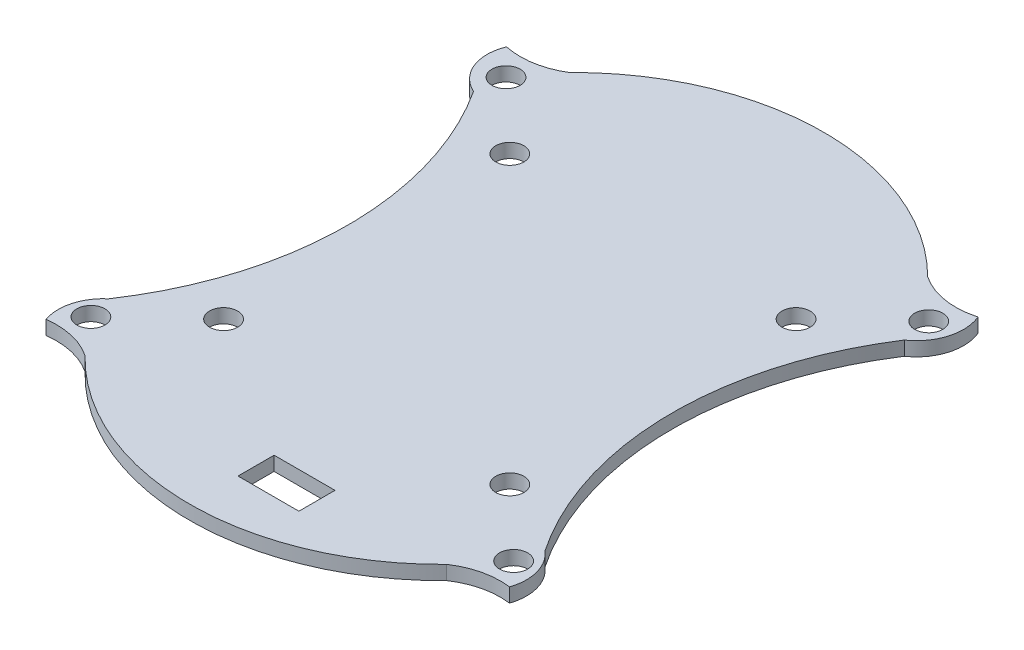
ISO-10303-21;
HEADER;
FILE_DESCRIPTION(('STEP AP214'),'2;1');
FILE_NAME('part.step','',(''),(''),'','','');
FILE_SCHEMA(('AUTOMOTIVE_DESIGN { 1 0 10303 214 1 1 1 1 }'));
ENDSEC;
DATA;
#1=APPLICATION_CONTEXT('core data for automotive mechanical design processes');
#2=APPLICATION_PROTOCOL_DEFINITION('international standard','automotive_design',2000,#1);
#3=PRODUCT_CONTEXT('',#1,'mechanical');
#4=PRODUCT('Part','Part','',(#3));
#5=PRODUCT_RELATED_PRODUCT_CATEGORY('part','',(#4));
#6=PRODUCT_DEFINITION_FORMATION('','',#4);
#7=PRODUCT_DEFINITION_CONTEXT('part definition',#1,'design');
#8=PRODUCT_DEFINITION('design','',#6,#7);
#9=PRODUCT_DEFINITION_SHAPE('','',#8);
#10=(LENGTH_UNIT() NAMED_UNIT(*) SI_UNIT(.MILLI.,.METRE.));
#11=(NAMED_UNIT(*) PLANE_ANGLE_UNIT() SI_UNIT($,.RADIAN.));
#12=(NAMED_UNIT(*) SI_UNIT($,.STERADIAN.) SOLID_ANGLE_UNIT());
#13=UNCERTAINTY_MEASURE_WITH_UNIT(LENGTH_MEASURE(1.E-05),#10,'distance_accuracy_value','');
#14=(GEOMETRIC_REPRESENTATION_CONTEXT(3) GLOBAL_UNCERTAINTY_ASSIGNED_CONTEXT((#13)) GLOBAL_UNIT_ASSIGNED_CONTEXT((#10,
#11,#12)) REPRESENTATION_CONTEXT('',''));
#15=CARTESIAN_POINT('',(0.,0.,0.));
#16=DIRECTION('',(0.,0.,1.));
#17=DIRECTION('',(1.,0.,0.));
#18=AXIS2_PLACEMENT_3D('',#15,#16,#17);
#19=CARTESIAN_POINT('',(0.,1.5,25.1156371011229));
#20=DIRECTION('',(0.,0.,-1.));
#21=DIRECTION('',(-1.,0.,0.));
#22=AXIS2_PLACEMENT_3D('',#19,#20,#21);
#23=PLANE('',#22);
#24=DIRECTION('',(1.,0.,0.));
#25=VECTOR('',#24,1.);
#26=CARTESIAN_POINT('',(0.,0.,25.1156371011229));
#27=LINE('',#26,#25);
#28=CARTESIAN_POINT('',(0.,0.,25.1156371011229));
#29=VERTEX_POINT('',#28);
#30=CARTESIAN_POINT('',(6.48858439949151,0.,25.1156371011229));
#31=VERTEX_POINT('',#30);
#32=EDGE_CURVE('E241',#29,#31,#27,.T.);
#33=ORIENTED_EDGE('',*,*,#32,.T.);
#34=DIRECTION('',(0.,-1.,0.));
#35=VECTOR('',#34,1.);
#36=CARTESIAN_POINT('',(6.48858439949151,1.5,25.1156371011229));
#37=LINE('',#36,#35);
#38=CARTESIAN_POINT('',(6.48858439949151,1.5,25.1156371011229));
#39=VERTEX_POINT('',#38);
#40=EDGE_CURVE('E11',#39,#31,#37,.T.);
#41=ORIENTED_EDGE('',*,*,#40,.F.);
#42=DIRECTION('',(1.,0.,0.));
#43=VECTOR('',#42,1.);
#44=CARTESIAN_POINT('',(0.,1.5,25.1156371011229));
#45=LINE('',#44,#43);
#46=CARTESIAN_POINT('',(0.,1.5,25.1156371011229));
#47=VERTEX_POINT('',#46);
#48=EDGE_CURVE('E164',#47,#39,#45,.T.);
#49=ORIENTED_EDGE('',*,*,#48,.F.);
#50=DIRECTION('',(0.,-1.,0.));
#51=VECTOR('',#50,1.);
#52=CARTESIAN_POINT('',(0.,1.5,25.1156371011229));
#53=LINE('',#52,#51);
#54=EDGE_CURVE('E55',#47,#29,#53,.T.);
#55=ORIENTED_EDGE('',*,*,#54,.T.);
#56=EDGE_LOOP('',(#33,#41,#49,#55));
#57=FACE_BOUND('',#56,.T.);
#58=ADVANCED_FACE('F36',(#57),#23,.F.);
#59=CARTESIAN_POINT('',(6.48858439949151,1.5,0.));
#60=DIRECTION('',(1.,0.,0.));
#61=DIRECTION('',(0.,0.,-1.));
#62=AXIS2_PLACEMENT_3D('',#59,#60,#61);
#63=PLANE('',#62);
#64=DIRECTION('',(0.,0.,1.));
#65=VECTOR('',#64,1.);
#66=CARTESIAN_POINT('',(6.48858439949151,0.,0.));
#67=LINE('',#66,#65);
#68=CARTESIAN_POINT('',(6.48858439949151,0.,28.9622381461072));
#69=VERTEX_POINT('',#68);
#70=EDGE_CURVE('E170',#31,#69,#67,.T.);
#71=ORIENTED_EDGE('',*,*,#70,.T.);
#72=DIRECTION('',(0.,-1.,0.));
#73=VECTOR('',#72,1.);
#74=CARTESIAN_POINT('',(6.48858439949151,1.5,28.9622381461072));
#75=LINE('',#74,#73);
#76=CARTESIAN_POINT('',(6.48858439949151,1.5,28.9622381461072));
#77=VERTEX_POINT('',#76);
#78=EDGE_CURVE('E46',#77,#69,#75,.T.);
#79=ORIENTED_EDGE('',*,*,#78,.F.);
#80=DIRECTION('',(0.,0.,1.));
#81=VECTOR('',#80,1.);
#82=CARTESIAN_POINT('',(6.48858439949151,1.5,0.));
#83=LINE('',#82,#81);
#84=EDGE_CURVE('E157',#39,#77,#83,.T.);
#85=ORIENTED_EDGE('',*,*,#84,.F.);
#86=ORIENTED_EDGE('',*,*,#40,.T.);
#87=EDGE_LOOP('',(#71,#79,#85,#86));
#88=FACE_BOUND('',#87,.T.);
#89=ADVANCED_FACE('F169',(#88),#63,.F.);
#90=CARTESIAN_POINT('',(0.,1.5,28.9622381461072));
#91=DIRECTION('',(0.,0.,-1.));
#92=DIRECTION('',(-1.,0.,0.));
#93=AXIS2_PLACEMENT_3D('',#90,#91,#92);
#94=PLANE('',#93);
#95=DIRECTION('',(1.,0.,0.));
#96=VECTOR('',#95,1.);
#97=CARTESIAN_POINT('',(0.,0.,28.9622381461072));
#98=LINE('',#97,#96);
#99=CARTESIAN_POINT('',(0.,0.,28.9622381461072));
#100=VERTEX_POINT('',#99);
#101=EDGE_CURVE('E244',#100,#69,#98,.T.);
#102=ORIENTED_EDGE('',*,*,#101,.F.);
#103=DIRECTION('',(0.,-1.,0.));
#104=VECTOR('',#103,1.);
#105=CARTESIAN_POINT('',(0.,1.5,28.9622381461072));
#106=LINE('',#105,#104);
#107=CARTESIAN_POINT('',(0.,1.5,28.9622381461072));
#108=VERTEX_POINT('',#107);
#109=EDGE_CURVE('E105',#108,#100,#106,.T.);
#110=ORIENTED_EDGE('',*,*,#109,.F.);
#111=DIRECTION('',(1.,0.,0.));
#112=VECTOR('',#111,1.);
#113=CARTESIAN_POINT('',(0.,1.5,28.9622381461072));
#114=LINE('',#113,#112);
#115=EDGE_CURVE('E163',#108,#77,#114,.T.);
#116=ORIENTED_EDGE('',*,*,#115,.T.);
#117=ORIENTED_EDGE('',*,*,#78,.T.);
#118=EDGE_LOOP('',(#102,#110,#116,#117));
#119=FACE_BOUND('',#118,.T.);
#120=ADVANCED_FACE('F174',(#119),#94,.T.);
#121=CARTESIAN_POINT('',(52.2988389245006,1.5,-0.0202742070100833));
#122=DIRECTION('',(0.,-1.,0.));
#123=DIRECTION('',(0.,0.,-1.));
#124=AXIS2_PLACEMENT_3D('',#121,#122,#123);
#125=CYLINDRICAL_SURFACE('',#124,35.);
#126=CARTESIAN_POINT('',(52.2988389245006,0.,-0.0202742070100833));
#127=DIRECTION('',(0.,1.,0.));
#128=DIRECTION('',(0.,0.,1.));
#129=AXIS2_PLACEMENT_3D('',#126,#127,#128);
#130=CIRCLE('',#129,35.);
#131=CARTESIAN_POINT('',(22.9453690464108,0.,-19.0826404325361));
#132=VERTEX_POINT('',#131);
#133=CARTESIAN_POINT('',(23.2479965445702,0.,19.5001908749607));
#134=VERTEX_POINT('',#133);
#135=EDGE_CURVE('E202',#132,#134,#130,.T.);
#136=ORIENTED_EDGE('',*,*,#135,.F.);
#137=DIRECTION('',(0.,-1.,0.));
#138=VECTOR('',#137,1.);
#139=CARTESIAN_POINT('',(22.9453690464108,1.5,-19.0826404325361));
#140=LINE('',#139,#138);
#141=CARTESIAN_POINT('',(22.9453690464108,1.5,-19.0826404325361));
#142=VERTEX_POINT('',#141);
#143=EDGE_CURVE('E40',#142,#132,#140,.T.);
#144=ORIENTED_EDGE('',*,*,#143,.F.);
#145=CARTESIAN_POINT('',(52.2988389245006,1.5,-0.0202742070100833));
#146=DIRECTION('',(0.,1.,0.));
#147=DIRECTION('',(0.,0.,1.));
#148=AXIS2_PLACEMENT_3D('',#145,#146,#147);
#149=CIRCLE('',#148,35.);
#150=CARTESIAN_POINT('',(23.2479965445702,1.5,19.5001908749607));
#151=VERTEX_POINT('',#150);
#152=EDGE_CURVE('E294',#142,#151,#149,.T.);
#153=ORIENTED_EDGE('',*,*,#152,.T.);
#154=DIRECTION('',(0.,-1.,0.));
#155=VECTOR('',#154,1.);
#156=CARTESIAN_POINT('',(23.2479965445702,1.5,19.5001908749607));
#157=LINE('',#156,#155);
#158=EDGE_CURVE('E186',#151,#134,#157,.T.);
#159=ORIENTED_EDGE('',*,*,#158,.T.);
#160=EDGE_LOOP('',(#136,#144,#153,#159));
#161=FACE_BOUND('',#160,.T.);
#162=ADVANCED_FACE('F293',(#161),#125,.F.);
#163=CARTESIAN_POINT('',(20.1331524965118,1.5,-23.2168196831823));
#164=DIRECTION('',(0.,-1.,0.));
#165=DIRECTION('',(0.,0.,-1.));
#166=AXIS2_PLACEMENT_3D('',#163,#164,#165);
#167=CYLINDRICAL_SURFACE('',#166,4.99999999999994);
#168=CARTESIAN_POINT('',(20.1331524965118,0.,-23.2168196831823));
#169=DIRECTION('',(0.,1.,0.));
#170=DIRECTION('',(0.,0.,1.));
#171=AXIS2_PLACEMENT_3D('',#168,#169,#170);
#172=CIRCLE('',#171,4.99999999999994);
#173=CARTESIAN_POINT('',(24.7501956341751,0.,-25.135911308133));
#174=VERTEX_POINT('',#173);
#175=EDGE_CURVE('E205',#132,#174,#172,.T.);
#176=ORIENTED_EDGE('',*,*,#175,.T.);
#177=DIRECTION('',(0.,-1.,0.));
#178=VECTOR('',#177,1.);
#179=CARTESIAN_POINT('',(24.7501956341751,1.5,-25.135911308133));
#180=LINE('',#179,#178);
#181=CARTESIAN_POINT('',(24.7501956341751,1.5,-25.135911308133));
#182=VERTEX_POINT('',#181);
#183=EDGE_CURVE('E279',#182,#174,#180,.T.);
#184=ORIENTED_EDGE('',*,*,#183,.F.);
#185=CARTESIAN_POINT('',(20.1331524965118,1.5,-23.2168196831823));
#186=DIRECTION('',(0.,1.,0.));
#187=DIRECTION('',(0.,0.,1.));
#188=AXIS2_PLACEMENT_3D('',#185,#186,#187);
#189=CIRCLE('',#188,4.99999999999994);
#190=EDGE_CURVE('E287',#142,#182,#189,.T.);
#191=ORIENTED_EDGE('',*,*,#190,.F.);
#192=ORIENTED_EDGE('',*,*,#143,.T.);
#193=EDGE_LOOP('',(#176,#184,#191,#192));
#194=FACE_BOUND('',#193,.T.);
#195=ADVANCED_FACE('F285',(#194),#167,.T.);
#196=CARTESIAN_POINT('',(22.6669223283037,1.5,-32.5632367808343));
#197=DIRECTION('',(0.,-1.,0.));
#198=DIRECTION('',(0.,0.,-1.));
#199=AXIS2_PLACEMENT_3D('',#196,#197,#198);
#200=CYLINDRICAL_SURFACE('',#199,7.71396080780776);
#201=CARTESIAN_POINT('',(22.6669223283037,0.,-32.5632367808343));
#202=DIRECTION('',(0.,1.,0.));
#203=DIRECTION('',(0.,0.,1.));
#204=AXIS2_PLACEMENT_3D('',#201,#202,#203);
#205=CIRCLE('',#204,7.71396080780776);
#206=CARTESIAN_POINT('',(18.3598915410994,0.,-26.16365264259));
#207=VERTEX_POINT('',#206);
#208=EDGE_CURVE('E208',#174,#207,#205,.F.);
#209=ORIENTED_EDGE('',*,*,#208,.T.);
#210=DIRECTION('',(0.,-1.,0.));
#211=VECTOR('',#210,1.);
#212=CARTESIAN_POINT('',(18.3598915410994,1.5,-26.16365264259));
#213=LINE('',#212,#211);
#214=CARTESIAN_POINT('',(18.3598915410994,1.5,-26.16365264259));
#215=VERTEX_POINT('',#214);
#216=EDGE_CURVE('E278',#215,#207,#213,.T.);
#217=ORIENTED_EDGE('',*,*,#216,.F.);
#218=CARTESIAN_POINT('',(22.6669223283037,1.5,-32.5632367808343));
#219=DIRECTION('',(0.,1.,0.));
#220=DIRECTION('',(0.,0.,1.));
#221=AXIS2_PLACEMENT_3D('',#218,#219,#220);
#222=CIRCLE('',#221,7.71396080780776);
#223=EDGE_CURVE('E631',#182,#215,#222,.F.);
#224=ORIENTED_EDGE('',*,*,#223,.F.);
#225=ORIENTED_EDGE('',*,*,#183,.T.);
#226=EDGE_LOOP('',(#209,#217,#224,#225));
#227=FACE_BOUND('',#226,.T.);
#228=ADVANCED_FACE('F345',(#227),#200,.F.);
#229=CARTESIAN_POINT('',(-0.494481329102561,1.5,-7.30927977238811));
#230=DIRECTION('',(0.,-1.,0.));
#231=DIRECTION('',(0.,0.,-1.));
#232=AXIS2_PLACEMENT_3D('',#229,#230,#231);
#233=CYLINDRICAL_SURFACE('',#232,26.6641098230789);
#234=CARTESIAN_POINT('',(-0.494481329102561,0.,-7.30927977238811));
#235=DIRECTION('',(0.,1.,0.));
#236=DIRECTION('',(0.,0.,1.));
#237=AXIS2_PLACEMENT_3D('',#234,#235,#236);
#238=CIRCLE('',#237,26.6641098230789);
#239=CARTESIAN_POINT('',(-19.5823192862826,0.,-25.9272601885785));
#240=VERTEX_POINT('',#239);
#241=EDGE_CURVE('E211',#240,#207,#238,.F.);
#242=ORIENTED_EDGE('',*,*,#241,.F.);
#243=DIRECTION('',(0.,-1.,0.));
#244=VECTOR('',#243,1.);
#245=CARTESIAN_POINT('',(-19.5823192862826,1.5,-25.9272601885785));
#246=LINE('',#245,#244);
#247=CARTESIAN_POINT('',(-19.5823192862826,1.5,-25.9272601885785));
#248=VERTEX_POINT('',#247);
#249=EDGE_CURVE('E276',#248,#240,#246,.T.);
#250=ORIENTED_EDGE('',*,*,#249,.F.);
#251=CARTESIAN_POINT('',(-0.494481329102561,1.5,-7.30927977238811));
#252=DIRECTION('',(0.,1.,0.));
#253=DIRECTION('',(0.,0.,1.));
#254=AXIS2_PLACEMENT_3D('',#251,#252,#253);
#255=CIRCLE('',#254,26.6641098230789);
#256=EDGE_CURVE('E344',#248,#215,#255,.F.);
#257=ORIENTED_EDGE('',*,*,#256,.T.);
#258=ORIENTED_EDGE('',*,*,#216,.T.);
#259=EDGE_LOOP('',(#242,#250,#257,#258));
#260=FACE_BOUND('',#259,.T.);
#261=ADVANCED_FACE('F342',(#260),#233,.T.);
#262=CARTESIAN_POINT('',(-23.6558849865088,1.5,-32.5632367808344));
#263=DIRECTION('',(0.,-1.,0.));
#264=DIRECTION('',(0.,0.,-1.));
#265=AXIS2_PLACEMENT_3D('',#262,#263,#264);
#266=CYLINDRICAL_SURFACE('',#265,7.78653471365966);
#267=CARTESIAN_POINT('',(-23.6558849865088,0.,-32.5632367808344));
#268=DIRECTION('',(0.,1.,0.));
#269=DIRECTION('',(0.,0.,1.));
#270=AXIS2_PLACEMENT_3D('',#267,#268,#269);
#271=CIRCLE('',#270,7.78653471365966);
#272=CARTESIAN_POINT('',(-25.2944195878264,0.,-24.951053965944));
#273=VERTEX_POINT('',#272);
#274=EDGE_CURVE('E214',#273,#240,#271,.T.);
#275=ORIENTED_EDGE('',*,*,#274,.F.);
#276=DIRECTION('',(0.,-1.,0.));
#277=VECTOR('',#276,1.);
#278=CARTESIAN_POINT('',(-25.2944195878264,1.5,-24.951053965944));
#279=LINE('',#278,#277);
#280=CARTESIAN_POINT('',(-25.2944195878264,1.5,-24.951053965944));
#281=VERTEX_POINT('',#280);
#282=EDGE_CURVE('E274',#281,#273,#279,.T.);
#283=ORIENTED_EDGE('',*,*,#282,.F.);
#284=CARTESIAN_POINT('',(-23.6558849865088,1.5,-32.5632367808344));
#285=DIRECTION('',(0.,1.,0.));
#286=DIRECTION('',(0.,0.,1.));
#287=AXIS2_PLACEMENT_3D('',#284,#285,#286);
#288=CIRCLE('',#287,7.78653471365966);
#289=EDGE_CURVE('E338',#281,#248,#288,.T.);
#290=ORIENTED_EDGE('',*,*,#289,.T.);
#291=ORIENTED_EDGE('',*,*,#249,.T.);
#292=EDGE_LOOP('',(#275,#283,#290,#291));
#293=FACE_BOUND('',#292,.T.);
#294=ADVANCED_FACE('F335',(#293),#266,.F.);
#295=CARTESIAN_POINT('',(-21.1221151547169,1.5,-23.2168196831823));
#296=DIRECTION('',(0.,-1.,0.));
#297=DIRECTION('',(0.,0.,-1.));
#298=AXIS2_PLACEMENT_3D('',#295,#296,#297);
#299=CYLINDRICAL_SURFACE('',#298,4.5183728077761);
#300=CARTESIAN_POINT('',(-21.1221151547169,0.,-23.2168196831823));
#301=DIRECTION('',(0.,1.,0.));
#302=DIRECTION('',(0.,0.,1.));
#303=AXIS2_PLACEMENT_3D('',#300,#301,#302);
#304=CIRCLE('',#303,4.5183728077761);
#305=CARTESIAN_POINT('',(-22.9453690464108,0.,-19.0826404325361));
#306=VERTEX_POINT('',#305);
#307=EDGE_CURVE('E217',#306,#273,#304,.F.);
#308=ORIENTED_EDGE('',*,*,#307,.F.);
#309=DIRECTION('',(0.,-1.,0.));
#310=VECTOR('',#309,1.);
#311=CARTESIAN_POINT('',(-22.9453690464108,1.5,-19.0826404325361));
#312=LINE('',#311,#310);
#313=CARTESIAN_POINT('',(-22.9453690464108,1.5,-19.0826404325361));
#314=VERTEX_POINT('',#313);
#315=EDGE_CURVE('E272',#314,#306,#312,.T.);
#316=ORIENTED_EDGE('',*,*,#315,.F.);
#317=CARTESIAN_POINT('',(-21.1221151547169,1.5,-23.2168196831823));
#318=DIRECTION('',(0.,1.,0.));
#319=DIRECTION('',(0.,0.,1.));
#320=AXIS2_PLACEMENT_3D('',#317,#318,#319);
#321=CIRCLE('',#320,4.5183728077761);
#322=EDGE_CURVE('E331',#314,#281,#321,.F.);
#323=ORIENTED_EDGE('',*,*,#322,.T.);
#324=ORIENTED_EDGE('',*,*,#282,.T.);
#325=EDGE_LOOP('',(#308,#316,#323,#324));
#326=FACE_BOUND('',#325,.T.);
#327=ADVANCED_FACE('F330',(#326),#299,.T.);
#328=CARTESIAN_POINT('',(-52.2988389245006,1.5,-0.0202742070100833));
#329=DIRECTION('',(0.,-1.,0.));
#330=DIRECTION('',(0.,0.,-1.));
#331=AXIS2_PLACEMENT_3D('',#328,#329,#330);
#332=CYLINDRICAL_SURFACE('',#331,35.);
#333=CARTESIAN_POINT('',(-52.2988389245006,0.,-0.0202742070100833));
#334=DIRECTION('',(0.,1.,0.));
#335=DIRECTION('',(0.,0.,1.));
#336=AXIS2_PLACEMENT_3D('',#333,#334,#335);
#337=CIRCLE('',#336,35.);
#338=CARTESIAN_POINT('',(-23.2479965445702,0.,19.5001908749607));
#339=VERTEX_POINT('',#338);
#340=EDGE_CURVE('E220',#306,#339,#337,.F.);
#341=ORIENTED_EDGE('',*,*,#340,.T.);
#342=DIRECTION('',(0.,-1.,0.));
#343=VECTOR('',#342,1.);
#344=CARTESIAN_POINT('',(-23.2479965445702,1.5,19.5001908749607));
#345=LINE('',#344,#343);
#346=CARTESIAN_POINT('',(-23.2479965445702,1.5,19.5001908749607));
#347=VERTEX_POINT('',#346);
#348=EDGE_CURVE('E269',#347,#339,#345,.T.);
#349=ORIENTED_EDGE('',*,*,#348,.F.);
#350=CARTESIAN_POINT('',(-52.2988389245006,1.5,-0.0202742070100833));
#351=DIRECTION('',(0.,1.,0.));
#352=DIRECTION('',(0.,0.,1.));
#353=AXIS2_PLACEMENT_3D('',#350,#351,#352);
#354=CIRCLE('',#353,35.);
#355=EDGE_CURVE('E326',#314,#347,#354,.F.);
#356=ORIENTED_EDGE('',*,*,#355,.F.);
#357=ORIENTED_EDGE('',*,*,#315,.T.);
#358=EDGE_LOOP('',(#341,#349,#356,#357));
#359=FACE_BOUND('',#358,.T.);
#360=ADVANCED_FACE('F325',(#359),#332,.F.);
#361=CARTESIAN_POINT('',(-20.1331524965118,1.5,23.1762712691621));
#362=DIRECTION('',(0.,-1.,0.));
#363=DIRECTION('',(0.,0.,-1.));
#364=AXIS2_PLACEMENT_3D('',#361,#362,#363);
#365=CYLINDRICAL_SURFACE('',#364,4.81827982877257);
#366=CARTESIAN_POINT('',(-20.1331524965118,0.,23.1762712691621));
#367=DIRECTION('',(0.,1.,0.));
#368=DIRECTION('',(0.,0.,1.));
#369=AXIS2_PLACEMENT_3D('',#366,#367,#368);
#370=CIRCLE('',#369,4.81827982877257);
#371=CARTESIAN_POINT('',(-24.6954210131797,0.,24.7259572019169));
#372=VERTEX_POINT('',#371);
#373=EDGE_CURVE('E223',#339,#372,#370,.T.);
#374=ORIENTED_EDGE('',*,*,#373,.T.);
#375=DIRECTION('',(0.,-1.,0.));
#376=VECTOR('',#375,1.);
#377=CARTESIAN_POINT('',(-24.6954210131797,1.5,24.7259572019169));
#378=LINE('',#377,#376);
#379=CARTESIAN_POINT('',(-24.6954210131797,1.5,24.7259572019169));
#380=VERTEX_POINT('',#379);
#381=EDGE_CURVE('E266',#380,#372,#378,.T.);
#382=ORIENTED_EDGE('',*,*,#381,.F.);
#383=CARTESIAN_POINT('',(-20.1331524965118,1.5,23.1762712691621));
#384=DIRECTION('',(0.,1.,0.));
#385=DIRECTION('',(0.,0.,1.));
#386=AXIS2_PLACEMENT_3D('',#383,#384,#385);
#387=CIRCLE('',#386,4.81827982877257);
#388=EDGE_CURVE('E321',#347,#380,#387,.T.);
#389=ORIENTED_EDGE('',*,*,#388,.F.);
#390=ORIENTED_EDGE('',*,*,#348,.T.);
#391=EDGE_LOOP('',(#374,#382,#389,#390));
#392=FACE_BOUND('',#391,.T.);
#393=ADVANCED_FACE('F319',(#392),#365,.T.);
#394=CARTESIAN_POINT('',(-23.6558849865089,1.5,32.5226883668141));
#395=DIRECTION('',(0.,-1.,0.));
#396=DIRECTION('',(0.,0.,-1.));
#397=AXIS2_PLACEMENT_3D('',#394,#395,#396);
#398=CYLINDRICAL_SURFACE('',#397,7.86572641327075);
#399=CARTESIAN_POINT('',(-23.6558849865089,0.,32.5226883668141));
#400=DIRECTION('',(0.,1.,0.));
#401=DIRECTION('',(0.,0.,1.));
#402=AXIS2_PLACEMENT_3D('',#399,#400,#401);
#403=CIRCLE('',#402,7.86572641327075);
#404=CARTESIAN_POINT('',(-19.2641170387908,0.,25.997197864038));
#405=VERTEX_POINT('',#404);
#406=EDGE_CURVE('E226',#372,#405,#403,.F.);
#407=ORIENTED_EDGE('',*,*,#406,.T.);
#408=DIRECTION('',(0.,-1.,0.));
#409=VECTOR('',#408,1.);
#410=CARTESIAN_POINT('',(-19.2641170387908,1.5,25.997197864038));
#411=LINE('',#410,#409);
#412=CARTESIAN_POINT('',(-19.2641170387908,1.5,25.997197864038));
#413=VERTEX_POINT('',#412);
#414=EDGE_CURVE('E263',#413,#405,#411,.T.);
#415=ORIENTED_EDGE('',*,*,#414,.F.);
#416=CARTESIAN_POINT('',(-23.6558849865089,1.5,32.5226883668141));
#417=DIRECTION('',(0.,1.,0.));
#418=DIRECTION('',(0.,0.,1.));
#419=AXIS2_PLACEMENT_3D('',#416,#417,#418);
#420=CIRCLE('',#419,7.86572641327075);
#421=EDGE_CURVE('E624',#380,#413,#420,.F.);
#422=ORIENTED_EDGE('',*,*,#421,.F.);
#423=ORIENTED_EDGE('',*,*,#381,.T.);
#424=EDGE_LOOP('',(#407,#415,#422,#423));
#425=FACE_BOUND('',#424,.T.);
#426=ADVANCED_FACE('F313',(#425),#398,.F.);
#427=CARTESIAN_POINT('',(0.,1.5,7.26873135836784));
#428=DIRECTION('',(0.,-1.,0.));
#429=DIRECTION('',(0.,0.,-1.));
#430=AXIS2_PLACEMENT_3D('',#427,#428,#429);
#431=CYLINDRICAL_SURFACE('',#430,26.8674833756017);
#432=CARTESIAN_POINT('',(0.,0.,7.26873135836784));
#433=DIRECTION('',(0.,1.,0.));
#434=DIRECTION('',(0.,0.,1.));
#435=AXIS2_PLACEMENT_3D('',#432,#433,#434);
#436=CIRCLE('',#435,26.8674833756017);
#437=CARTESIAN_POINT('',(19.2641170387907,0.,25.997197864038));
#438=VERTEX_POINT('',#437);
#439=EDGE_CURVE('E229',#405,#438,#436,.T.);
#440=ORIENTED_EDGE('',*,*,#439,.T.);
#441=DIRECTION('',(0.,-1.,0.));
#442=VECTOR('',#441,1.);
#443=CARTESIAN_POINT('',(19.2641170387907,1.5,25.997197864038));
#444=LINE('',#443,#442);
#445=CARTESIAN_POINT('',(19.2641170387907,1.5,25.997197864038));
#446=VERTEX_POINT('',#445);
#447=EDGE_CURVE('E261',#446,#438,#444,.T.);
#448=ORIENTED_EDGE('',*,*,#447,.F.);
#449=CARTESIAN_POINT('',(0.,1.5,7.26873135836784));
#450=DIRECTION('',(0.,1.,0.));
#451=DIRECTION('',(0.,0.,1.));
#452=AXIS2_PLACEMENT_3D('',#449,#450,#451);
#453=CIRCLE('',#452,26.8674833756017);
#454=EDGE_CURVE('E310',#413,#446,#453,.T.);
#455=ORIENTED_EDGE('',*,*,#454,.F.);
#456=ORIENTED_EDGE('',*,*,#414,.T.);
#457=EDGE_LOOP('',(#440,#448,#455,#456));
#458=FACE_BOUND('',#457,.T.);
#459=ADVANCED_FACE('F308',(#458),#431,.T.);
#460=CARTESIAN_POINT('',(23.6558849865088,1.5,32.5226883668141));
#461=DIRECTION('',(0.,-1.,0.));
#462=DIRECTION('',(0.,0.,-1.));
#463=AXIS2_PLACEMENT_3D('',#460,#461,#462);
#464=CYLINDRICAL_SURFACE('',#463,7.86572641327075);
#465=CARTESIAN_POINT('',(23.6558849865088,0.,32.5226883668141));
#466=DIRECTION('',(0.,1.,0.));
#467=DIRECTION('',(0.,0.,1.));
#468=AXIS2_PLACEMENT_3D('',#465,#466,#467);
#469=CIRCLE('',#468,7.86572641327075);
#470=CARTESIAN_POINT('',(24.6954210131796,0.,24.7259572019169));
#471=VERTEX_POINT('',#470);
#472=EDGE_CURVE('E232',#471,#438,#469,.T.);
#473=ORIENTED_EDGE('',*,*,#472,.F.);
#474=DIRECTION('',(0.,-1.,0.));
#475=VECTOR('',#474,1.);
#476=CARTESIAN_POINT('',(24.6954210131796,1.5,24.7259572019169));
#477=LINE('',#476,#475);
#478=CARTESIAN_POINT('',(24.6954210131796,1.5,24.7259572019169));
#479=VERTEX_POINT('',#478);
#480=EDGE_CURVE('E259',#479,#471,#477,.T.);
#481=ORIENTED_EDGE('',*,*,#480,.F.);
#482=CARTESIAN_POINT('',(23.6558849865088,1.5,32.5226883668141));
#483=DIRECTION('',(0.,1.,0.));
#484=DIRECTION('',(0.,0.,1.));
#485=AXIS2_PLACEMENT_3D('',#482,#483,#484);
#486=CIRCLE('',#485,7.86572641327075);
#487=EDGE_CURVE('E306',#479,#446,#486,.T.);
#488=ORIENTED_EDGE('',*,*,#487,.T.);
#489=ORIENTED_EDGE('',*,*,#447,.T.);
#490=EDGE_LOOP('',(#473,#481,#488,#489));
#491=FACE_BOUND('',#490,.T.);
#492=ADVANCED_FACE('F302',(#491),#464,.F.);
#493=CARTESIAN_POINT('',(22.5199115084598,1.5,22.1164682813775));
#494=DIRECTION('',(0.,-1.,0.));
#495=DIRECTION('',(0.,0.,-1.));
#496=AXIS2_PLACEMENT_3D('',#493,#494,#495);
#497=CYLINDRICAL_SURFACE('',#496,1.50000000000001);
#498=CARTESIAN_POINT('',(22.5199115084598,1.5,22.1164682813775));
#499=DIRECTION('',(0.,1.,0.));
#500=DIRECTION('',(0.,0.,1.));
#501=AXIS2_PLACEMENT_3D('',#498,#499,#500);
#502=CIRCLE('',#501,1.50000000000001);
#503=CARTESIAN_POINT('',(22.5199115084598,1.5,23.6164682813775));
#504=VERTEX_POINT('',#503);
#505=EDGE_CURVE('E177',#504,#504,#502,.T.);
#506=ORIENTED_EDGE('',*,*,#505,.T.);
#507=EDGE_LOOP('',(#506));
#508=FACE_BOUND('',#507,.T.);
#509=CARTESIAN_POINT('',(22.5199115084598,0.,22.1164682813775));
#510=DIRECTION('',(0.,1.,0.));
#511=DIRECTION('',(0.,0.,1.));
#512=AXIS2_PLACEMENT_3D('',#509,#510,#511);
#513=CIRCLE('',#512,1.50000000000001);
#514=CARTESIAN_POINT('',(22.5199115084598,0.,23.6164682813775));
#515=VERTEX_POINT('',#514);
#516=EDGE_CURVE('E249',#515,#515,#513,.T.);
#517=ORIENTED_EDGE('',*,*,#516,.F.);
#518=EDGE_LOOP('',(#517));
#519=FACE_BOUND('',#518,.T.);
#520=ADVANCED_FACE('F372',(#508,#519),#497,.F.);
#521=CARTESIAN_POINT('',(0.,1.5,0.));
#522=DIRECTION('',(1.,0.,0.));
#523=DIRECTION('',(0.,0.,-1.));
#524=AXIS2_PLACEMENT_3D('',#521,#522,#523);
#525=PLANE('',#524);
#526=DIRECTION('',(0.,0.,1.));
#527=VECTOR('',#526,1.);
#528=CARTESIAN_POINT('',(0.,0.,0.));
#529=LINE('',#528,#527);
#530=EDGE_CURVE('E246',#29,#100,#529,.T.);
#531=ORIENTED_EDGE('',*,*,#530,.F.);
#532=ORIENTED_EDGE('',*,*,#54,.F.);
#533=DIRECTION('',(0.,0.,1.));
#534=VECTOR('',#533,1.);
#535=CARTESIAN_POINT('',(0.,1.5,0.));
#536=LINE('',#535,#534);
#537=EDGE_CURVE('E175',#47,#108,#536,.T.);
#538=ORIENTED_EDGE('',*,*,#537,.T.);
#539=ORIENTED_EDGE('',*,*,#109,.T.);
#540=EDGE_LOOP('',(#531,#532,#538,#539));
#541=FACE_BOUND('',#540,.T.);
#542=ADVANCED_FACE('F365',(#541),#525,.T.);
#543=CARTESIAN_POINT('',(-15.25,1.5,-15.25));
#544=DIRECTION('',(0.,-1.,0.));
#545=DIRECTION('',(0.,0.,-1.));
#546=AXIS2_PLACEMENT_3D('',#543,#544,#545);
#547=CYLINDRICAL_SURFACE('',#546,1.5);
#548=CARTESIAN_POINT('',(-15.25,1.5,-15.25));
#549=DIRECTION('',(0.,1.,0.));
#550=DIRECTION('',(0.,0.,1.));
#551=AXIS2_PLACEMENT_3D('',#548,#549,#550);
#552=CIRCLE('',#551,1.5);
#553=CARTESIAN_POINT('',(-15.25,1.5,-13.75));
#554=VERTEX_POINT('',#553);
#555=EDGE_CURVE('E618',#554,#554,#552,.T.);
#556=ORIENTED_EDGE('',*,*,#555,.T.);
#557=EDGE_LOOP('',(#556));
#558=FACE_BOUND('',#557,.T.);
#559=CARTESIAN_POINT('',(-15.25,0.,-15.25));
#560=DIRECTION('',(0.,1.,0.));
#561=DIRECTION('',(0.,0.,1.));
#562=AXIS2_PLACEMENT_3D('',#559,#560,#561);
#563=CIRCLE('',#562,1.5);
#564=CARTESIAN_POINT('',(-15.25,0.,-13.75));
#565=VERTEX_POINT('',#564);
#566=EDGE_CURVE('E238',#565,#565,#563,.T.);
#567=ORIENTED_EDGE('',*,*,#566,.F.);
#568=EDGE_LOOP('',(#567));
#569=FACE_BOUND('',#568,.T.);
#570=ADVANCED_FACE('F362',(#558,#569),#547,.F.);
#571=CARTESIAN_POINT('',(20.1331524965118,1.5,23.1762712691621));
#572=DIRECTION('',(0.,-1.,0.));
#573=DIRECTION('',(0.,0.,-1.));
#574=AXIS2_PLACEMENT_3D('',#571,#572,#573);
#575=CYLINDRICAL_SURFACE('',#574,4.81827982877257);
#576=CARTESIAN_POINT('',(20.1331524965118,0.,23.1762712691621));
#577=DIRECTION('',(0.,1.,0.));
#578=DIRECTION('',(0.,0.,1.));
#579=AXIS2_PLACEMENT_3D('',#576,#577,#578);
#580=CIRCLE('',#579,4.81827982877257);
#581=EDGE_CURVE('E235',#134,#471,#580,.F.);
#582=ORIENTED_EDGE('',*,*,#581,.F.);
#583=ORIENTED_EDGE('',*,*,#158,.F.);
#584=CARTESIAN_POINT('',(20.1331524965118,1.5,23.1762712691621));
#585=DIRECTION('',(0.,1.,0.));
#586=DIRECTION('',(0.,0.,1.));
#587=AXIS2_PLACEMENT_3D('',#584,#585,#586);
#588=CIRCLE('',#587,4.81827982877257);
#589=EDGE_CURVE('E299',#151,#479,#588,.F.);
#590=ORIENTED_EDGE('',*,*,#589,.T.);
#591=ORIENTED_EDGE('',*,*,#480,.T.);
#592=EDGE_LOOP('',(#582,#583,#590,#591));
#593=FACE_BOUND('',#592,.T.);
#594=ADVANCED_FACE('F298',(#593),#575,.T.);
#595=CARTESIAN_POINT('',(-22.5199115084598,1.5,-22.1164682813776));
#596=DIRECTION('',(0.,-1.,0.));
#597=DIRECTION('',(0.,0.,-1.));
#598=AXIS2_PLACEMENT_3D('',#595,#596,#597);
#599=CYLINDRICAL_SURFACE('',#598,1.5);
#600=CARTESIAN_POINT('',(-22.5199115084598,1.5,-22.1164682813776));
#601=DIRECTION('',(0.,1.,0.));
#602=DIRECTION('',(0.,0.,1.));
#603=AXIS2_PLACEMENT_3D('',#600,#601,#602);
#604=CIRCLE('',#603,1.5);
#605=CARTESIAN_POINT('',(-22.5199115084598,1.5,-20.6164682813776));
#606=VERTEX_POINT('',#605);
#607=EDGE_CURVE('E614',#606,#606,#604,.T.);
#608=ORIENTED_EDGE('',*,*,#607,.T.);
#609=EDGE_LOOP('',(#608));
#610=FACE_BOUND('',#609,.T.);
#611=CARTESIAN_POINT('',(-22.5199115084598,0.,-22.1164682813776));
#612=DIRECTION('',(0.,1.,0.));
#613=DIRECTION('',(0.,0.,1.));
#614=AXIS2_PLACEMENT_3D('',#611,#612,#613);
#615=CIRCLE('',#614,1.5);
#616=CARTESIAN_POINT('',(-22.5199115084598,0.,-20.6164682813776));
#617=VERTEX_POINT('',#616);
#618=EDGE_CURVE('E199',#617,#617,#615,.T.);
#619=ORIENTED_EDGE('',*,*,#618,.F.);
#620=EDGE_LOOP('',(#619));
#621=FACE_BOUND('',#620,.T.);
#622=ADVANCED_FACE('F369',(#610,#621),#599,.F.);
#623=CARTESIAN_POINT('',(22.5199115084598,1.5,-22.1164682813775));
#624=DIRECTION('',(0.,-1.,0.));
#625=DIRECTION('',(0.,0.,-1.));
#626=AXIS2_PLACEMENT_3D('',#623,#624,#625);
#627=CYLINDRICAL_SURFACE('',#626,1.50000000000001);
#628=CARTESIAN_POINT('',(22.5199115084598,1.5,-22.1164682813775));
#629=DIRECTION('',(0.,1.,0.));
#630=DIRECTION('',(0.,0.,1.));
#631=AXIS2_PLACEMENT_3D('',#628,#629,#630);
#632=CIRCLE('',#631,1.50000000000001);
#633=CARTESIAN_POINT('',(22.5199115084598,1.5,-20.6164682813775));
#634=VERTEX_POINT('',#633);
#635=EDGE_CURVE('E610',#634,#634,#632,.F.);
#636=ORIENTED_EDGE('',*,*,#635,.F.);
#637=EDGE_LOOP('',(#636));
#638=FACE_BOUND('',#637,.T.);
#639=CARTESIAN_POINT('',(22.5199115084598,0.,-22.1164682813775));
#640=DIRECTION('',(0.,1.,0.));
#641=DIRECTION('',(0.,0.,1.));
#642=AXIS2_PLACEMENT_3D('',#639,#640,#641);
#643=CIRCLE('',#642,1.50000000000001);
#644=CARTESIAN_POINT('',(22.5199115084598,0.,-20.6164682813775));
#645=VERTEX_POINT('',#644);
#646=EDGE_CURVE('E196',#645,#645,#643,.F.);
#647=ORIENTED_EDGE('',*,*,#646,.T.);
#648=EDGE_LOOP('',(#647));
#649=FACE_BOUND('',#648,.T.);
#650=ADVANCED_FACE('F439',(#638,#649),#627,.F.);
#651=CARTESIAN_POINT('',(15.25,1.5,-15.25));
#652=DIRECTION('',(0.,-1.,0.));
#653=DIRECTION('',(0.,0.,-1.));
#654=AXIS2_PLACEMENT_3D('',#651,#652,#653);
#655=CYLINDRICAL_SURFACE('',#654,1.5);
#656=CARTESIAN_POINT('',(15.25,1.5,-15.25));
#657=DIRECTION('',(0.,1.,0.));
#658=DIRECTION('',(0.,0.,1.));
#659=AXIS2_PLACEMENT_3D('',#656,#657,#658);
#660=CIRCLE('',#659,1.5);
#661=CARTESIAN_POINT('',(15.25,1.5,-13.75));
#662=VERTEX_POINT('',#661);
#663=EDGE_CURVE('E606',#662,#662,#660,.T.);
#664=ORIENTED_EDGE('',*,*,#663,.T.);
#665=EDGE_LOOP('',(#664));
#666=FACE_BOUND('',#665,.T.);
#667=CARTESIAN_POINT('',(15.25,0.,-15.25));
#668=DIRECTION('',(0.,1.,0.));
#669=DIRECTION('',(0.,0.,1.));
#670=AXIS2_PLACEMENT_3D('',#667,#668,#669);
#671=CIRCLE('',#670,1.5);
#672=CARTESIAN_POINT('',(15.25,0.,-13.75));
#673=VERTEX_POINT('',#672);
#674=EDGE_CURVE('E193',#673,#673,#671,.T.);
#675=ORIENTED_EDGE('',*,*,#674,.F.);
#676=EDGE_LOOP('',(#675));
#677=FACE_BOUND('',#676,.T.);
#678=ADVANCED_FACE('F447',(#666,#677),#655,.F.);
#679=CARTESIAN_POINT('',(-15.25,1.5,15.25));
#680=DIRECTION('',(0.,-1.,0.));
#681=DIRECTION('',(0.,0.,-1.));
#682=AXIS2_PLACEMENT_3D('',#679,#680,#681);
#683=CYLINDRICAL_SURFACE('',#682,1.5);
#684=CARTESIAN_POINT('',(-15.25,1.5,15.25));
#685=DIRECTION('',(0.,1.,0.));
#686=DIRECTION('',(0.,0.,1.));
#687=AXIS2_PLACEMENT_3D('',#684,#685,#686);
#688=CIRCLE('',#687,1.5);
#689=CARTESIAN_POINT('',(-15.25,1.5,16.75));
#690=VERTEX_POINT('',#689);
#691=EDGE_CURVE('E602',#690,#690,#688,.T.);
#692=ORIENTED_EDGE('',*,*,#691,.T.);
#693=EDGE_LOOP('',(#692));
#694=FACE_BOUND('',#693,.T.);
#695=CARTESIAN_POINT('',(-15.25,0.,15.25));
#696=DIRECTION('',(0.,1.,0.));
#697=DIRECTION('',(0.,0.,1.));
#698=AXIS2_PLACEMENT_3D('',#695,#696,#697);
#699=CIRCLE('',#698,1.5);
#700=CARTESIAN_POINT('',(-15.25,0.,16.75));
#701=VERTEX_POINT('',#700);
#702=EDGE_CURVE('E190',#701,#701,#699,.T.);
#703=ORIENTED_EDGE('',*,*,#702,.F.);
#704=EDGE_LOOP('',(#703));
#705=FACE_BOUND('',#704,.T.);
#706=ADVANCED_FACE('F455',(#694,#705),#683,.F.);
#707=CARTESIAN_POINT('',(15.25,1.5,15.25));
#708=DIRECTION('',(0.,-1.,0.));
#709=DIRECTION('',(0.,0.,-1.));
#710=AXIS2_PLACEMENT_3D('',#707,#708,#709);
#711=CYLINDRICAL_SURFACE('',#710,1.5);
#712=CARTESIAN_POINT('',(15.25,1.5,15.25));
#713=DIRECTION('',(0.,1.,0.));
#714=DIRECTION('',(0.,0.,1.));
#715=AXIS2_PLACEMENT_3D('',#712,#713,#714);
#716=CIRCLE('',#715,1.5);
#717=CARTESIAN_POINT('',(15.25,1.5,16.75));
#718=VERTEX_POINT('',#717);
#719=EDGE_CURVE('E255',#718,#718,#716,.T.);
#720=ORIENTED_EDGE('',*,*,#719,.T.);
#721=EDGE_LOOP('',(#720));
#722=FACE_BOUND('',#721,.T.);
#723=CARTESIAN_POINT('',(15.25,0.,15.25));
#724=DIRECTION('',(0.,1.,0.));
#725=DIRECTION('',(0.,0.,1.));
#726=AXIS2_PLACEMENT_3D('',#723,#724,#725);
#727=CIRCLE('',#726,1.5);
#728=CARTESIAN_POINT('',(15.25,0.,16.75));
#729=VERTEX_POINT('',#728);
#730=EDGE_CURVE('E187',#729,#729,#727,.T.);
#731=ORIENTED_EDGE('',*,*,#730,.F.);
#732=EDGE_LOOP('',(#731));
#733=FACE_BOUND('',#732,.T.);
#734=ADVANCED_FACE('F38',(#722,#733),#711,.F.);
#735=CARTESIAN_POINT('',(-22.5199115084598,1.5,22.1164682813776));
#736=DIRECTION('',(0.,-1.,0.));
#737=DIRECTION('',(0.,0.,-1.));
#738=AXIS2_PLACEMENT_3D('',#735,#736,#737);
#739=CYLINDRICAL_SURFACE('',#738,1.5);
#740=CARTESIAN_POINT('',(-22.5199115084598,1.5,22.1164682813776));
#741=DIRECTION('',(0.,1.,0.));
#742=DIRECTION('',(0.,0.,1.));
#743=AXIS2_PLACEMENT_3D('',#740,#741,#742);
#744=CIRCLE('',#743,1.5);
#745=CARTESIAN_POINT('',(-22.5199115084598,1.5,23.6164682813776));
#746=VERTEX_POINT('',#745);
#747=EDGE_CURVE('E183',#746,#746,#744,.F.);
#748=ORIENTED_EDGE('',*,*,#747,.F.);
#749=EDGE_LOOP('',(#748));
#750=FACE_BOUND('',#749,.T.);
#751=CARTESIAN_POINT('',(-22.5199115084598,0.,22.1164682813776));
#752=DIRECTION('',(0.,1.,0.));
#753=DIRECTION('',(0.,0.,1.));
#754=AXIS2_PLACEMENT_3D('',#751,#752,#753);
#755=CIRCLE('',#754,1.5);
#756=CARTESIAN_POINT('',(-22.5199115084598,0.,23.6164682813776));
#757=VERTEX_POINT('',#756);
#758=EDGE_CURVE('E252',#757,#757,#755,.F.);
#759=ORIENTED_EDGE('',*,*,#758,.T.);
#760=EDGE_LOOP('',(#759));
#761=FACE_BOUND('',#760,.T.);
#762=ADVANCED_FACE('F469',(#750,#761),#739,.F.);
#763=CARTESIAN_POINT('',(0.,1.5,0.));
#764=DIRECTION('',(0.,1.,0.));
#765=DIRECTION('',(0.,0.,1.));
#766=AXIS2_PLACEMENT_3D('',#763,#764,#765);
#767=PLANE('',#766);
#768=ORIENTED_EDGE('',*,*,#719,.F.);
#769=EDGE_LOOP('',(#768));
#770=FACE_BOUND('',#769,.T.);
#771=ORIENTED_EDGE('',*,*,#691,.F.);
#772=EDGE_LOOP('',(#771));
#773=FACE_BOUND('',#772,.T.);
#774=ORIENTED_EDGE('',*,*,#663,.F.);
#775=EDGE_LOOP('',(#774));
#776=FACE_BOUND('',#775,.T.);
#777=ORIENTED_EDGE('',*,*,#635,.T.);
#778=EDGE_LOOP('',(#777));
#779=FACE_BOUND('',#778,.T.);
#780=ORIENTED_EDGE('',*,*,#607,.F.);
#781=EDGE_LOOP('',(#780));
#782=FACE_BOUND('',#781,.T.);
#783=ORIENTED_EDGE('',*,*,#152,.F.);
#784=ORIENTED_EDGE('',*,*,#190,.T.);
#785=ORIENTED_EDGE('',*,*,#223,.T.);
#786=ORIENTED_EDGE('',*,*,#256,.F.);
#787=ORIENTED_EDGE('',*,*,#289,.F.);
#788=ORIENTED_EDGE('',*,*,#322,.F.);
#789=ORIENTED_EDGE('',*,*,#355,.T.);
#790=ORIENTED_EDGE('',*,*,#388,.T.);
#791=ORIENTED_EDGE('',*,*,#421,.T.);
#792=ORIENTED_EDGE('',*,*,#454,.T.);
#793=ORIENTED_EDGE('',*,*,#487,.F.);
#794=ORIENTED_EDGE('',*,*,#589,.F.);
#795=EDGE_LOOP('',(#783,#784,#785,#786,#787,#788,#789,#790,#791,#792,#793,#794));
#796=FACE_BOUND('',#795,.T.);
#797=ORIENTED_EDGE('',*,*,#555,.F.);
#798=EDGE_LOOP('',(#797));
#799=FACE_BOUND('',#798,.T.);
#800=ORIENTED_EDGE('',*,*,#48,.T.);
#801=ORIENTED_EDGE('',*,*,#84,.T.);
#802=ORIENTED_EDGE('',*,*,#115,.F.);
#803=ORIENTED_EDGE('',*,*,#537,.F.);
#804=EDGE_LOOP('',(#800,#801,#802,#803));
#805=FACE_BOUND('',#804,.T.);
#806=ORIENTED_EDGE('',*,*,#505,.F.);
#807=EDGE_LOOP('',(#806));
#808=FACE_BOUND('',#807,.T.);
#809=ORIENTED_EDGE('',*,*,#747,.T.);
#810=EDGE_LOOP('',(#809));
#811=FACE_BOUND('',#810,.T.);
#812=ADVANCED_FACE('F159',(#770,#773,#776,#779,#782,#796,#799,#805,#808,#811),#767,.T.);
#813=CARTESIAN_POINT('',(0.,0.,0.));
#814=DIRECTION('',(0.,1.,0.));
#815=DIRECTION('',(0.,0.,1.));
#816=AXIS2_PLACEMENT_3D('',#813,#814,#815);
#817=PLANE('',#816);
#818=ORIENTED_EDGE('',*,*,#730,.T.);
#819=EDGE_LOOP('',(#818));
#820=FACE_BOUND('',#819,.T.);
#821=ORIENTED_EDGE('',*,*,#702,.T.);
#822=EDGE_LOOP('',(#821));
#823=FACE_BOUND('',#822,.T.);
#824=ORIENTED_EDGE('',*,*,#674,.T.);
#825=EDGE_LOOP('',(#824));
#826=FACE_BOUND('',#825,.T.);
#827=ORIENTED_EDGE('',*,*,#646,.F.);
#828=EDGE_LOOP('',(#827));
#829=FACE_BOUND('',#828,.T.);
#830=ORIENTED_EDGE('',*,*,#618,.T.);
#831=EDGE_LOOP('',(#830));
#832=FACE_BOUND('',#831,.T.);
#833=ORIENTED_EDGE('',*,*,#135,.T.);
#834=ORIENTED_EDGE('',*,*,#581,.T.);
#835=ORIENTED_EDGE('',*,*,#472,.T.);
#836=ORIENTED_EDGE('',*,*,#439,.F.);
#837=ORIENTED_EDGE('',*,*,#406,.F.);
#838=ORIENTED_EDGE('',*,*,#373,.F.);
#839=ORIENTED_EDGE('',*,*,#340,.F.);
#840=ORIENTED_EDGE('',*,*,#307,.T.);
#841=ORIENTED_EDGE('',*,*,#274,.T.);
#842=ORIENTED_EDGE('',*,*,#241,.T.);
#843=ORIENTED_EDGE('',*,*,#208,.F.);
#844=ORIENTED_EDGE('',*,*,#175,.F.);
#845=EDGE_LOOP('',(#833,#834,#835,#836,#837,#838,#839,#840,#841,#842,#843,#844));
#846=FACE_BOUND('',#845,.T.);
#847=ORIENTED_EDGE('',*,*,#566,.T.);
#848=EDGE_LOOP('',(#847));
#849=FACE_BOUND('',#848,.T.);
#850=ORIENTED_EDGE('',*,*,#32,.F.);
#851=ORIENTED_EDGE('',*,*,#530,.T.);
#852=ORIENTED_EDGE('',*,*,#101,.T.);
#853=ORIENTED_EDGE('',*,*,#70,.F.);
#854=EDGE_LOOP('',(#850,#851,#852,#853));
#855=FACE_BOUND('',#854,.T.);
#856=ORIENTED_EDGE('',*,*,#516,.T.);
#857=EDGE_LOOP('',(#856));
#858=FACE_BOUND('',#857,.T.);
#859=ORIENTED_EDGE('',*,*,#758,.F.);
#860=EDGE_LOOP('',(#859));
#861=FACE_BOUND('',#860,.T.);
#862=ADVANCED_FACE('F290',(#820,#823,#826,#829,#832,#846,#849,#855,#858,#861),#817,.F.);
#863=CLOSED_SHELL('',(#58,#89,#120,#162,#195,#228,#261,#294,#327,#360,#393,#426,#459,#492,#520,
#542,#570,#594,#622,#650,#678,#706,#734,#762,#812,#862));
#864=MANIFOLD_SOLID_BREP('B2',#863);
#865=ADVANCED_BREP_SHAPE_REPRESENTATION('',(#18,#864),#14);
#866=SHAPE_DEFINITION_REPRESENTATION(#9,#865);
ENDSEC;
END-ISO-10303-21;
